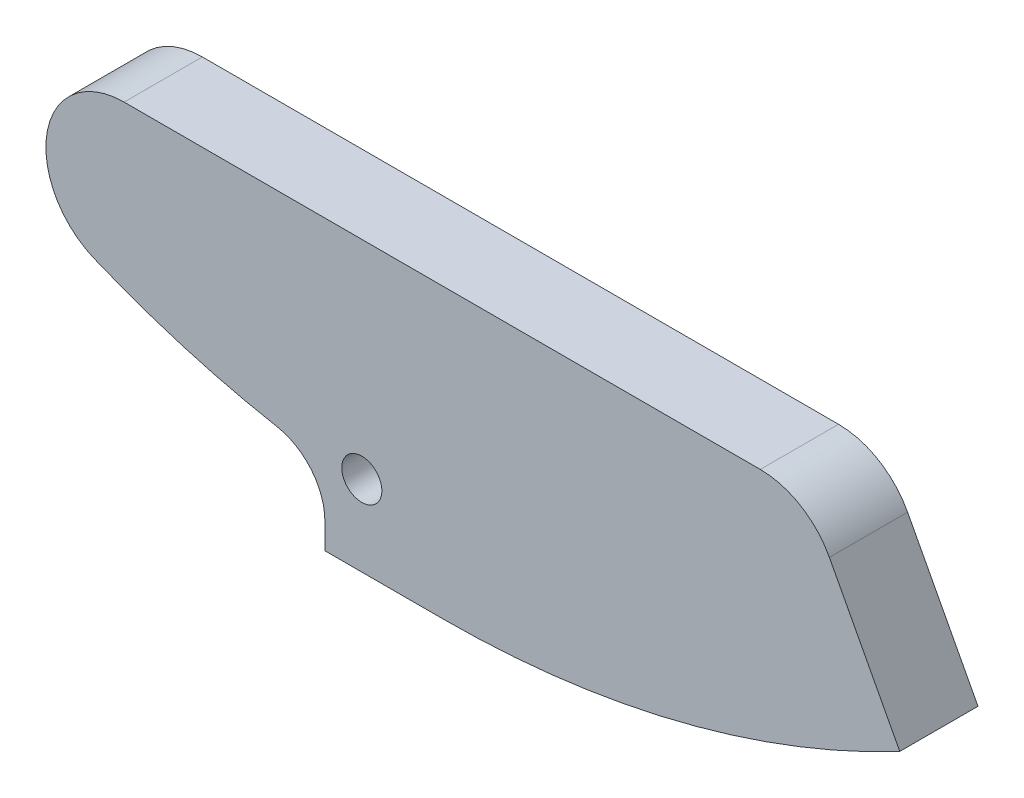
ISO-10303-21;
HEADER;
FILE_DESCRIPTION(('STEP AP214'),'2;1');
FILE_NAME('part.step','',(''),(''),'','','');
FILE_SCHEMA(('AUTOMOTIVE_DESIGN { 1 0 10303 214 1 1 1 1 }'));
ENDSEC;
DATA;
#1=APPLICATION_CONTEXT('core data for automotive mechanical design processes');
#2=APPLICATION_PROTOCOL_DEFINITION('international standard','automotive_design',2000,#1);
#3=PRODUCT_CONTEXT('',#1,'mechanical');
#4=PRODUCT('Part','Part','',(#3));
#5=PRODUCT_RELATED_PRODUCT_CATEGORY('part','',(#4));
#6=PRODUCT_DEFINITION_FORMATION('','',#4);
#7=PRODUCT_DEFINITION_CONTEXT('part definition',#1,'design');
#8=PRODUCT_DEFINITION('design','',#6,#7);
#9=PRODUCT_DEFINITION_SHAPE('','',#8);
#10=(LENGTH_UNIT() NAMED_UNIT(*) SI_UNIT(.MILLI.,.METRE.));
#11=(NAMED_UNIT(*) PLANE_ANGLE_UNIT() SI_UNIT($,.RADIAN.));
#12=(NAMED_UNIT(*) SI_UNIT($,.STERADIAN.) SOLID_ANGLE_UNIT());
#13=UNCERTAINTY_MEASURE_WITH_UNIT(LENGTH_MEASURE(1.E-05),#10,'distance_accuracy_value','');
#14=(GEOMETRIC_REPRESENTATION_CONTEXT(3) GLOBAL_UNCERTAINTY_ASSIGNED_CONTEXT((#13)) GLOBAL_UNIT_ASSIGNED_CONTEXT((#10,
#11,#12)) REPRESENTATION_CONTEXT('',''));
#15=CARTESIAN_POINT('',(0.,0.,0.));
#16=DIRECTION('',(0.,0.,1.));
#17=DIRECTION('',(1.,0.,0.));
#18=AXIS2_PLACEMENT_3D('',#15,#16,#17);
#19=CARTESIAN_POINT('',(0.,0.,4.));
#20=DIRECTION('',(0.,0.,-1.));
#21=DIRECTION('',(-1.,0.,0.));
#22=AXIS2_PLACEMENT_3D('',#19,#20,#21);
#23=CYLINDRICAL_SURFACE('',#22,50.);
#24=CARTESIAN_POINT('',(0.,0.,0.));
#25=DIRECTION('',(0.,0.,1.));
#26=DIRECTION('',(1.,0.,0.));
#27=AXIS2_PLACEMENT_3D('',#24,#25,#26);
#28=CIRCLE('',#27,50.);
#29=CARTESIAN_POINT('',(0.,-50.,0.));
#30=VERTEX_POINT('',#29);
#31=CARTESIAN_POINT('',(23.3969049927199,-44.1880621521428,0.));
#32=VERTEX_POINT('',#31);
#33=EDGE_CURVE('E140',#30,#32,#28,.T.);
#34=ORIENTED_EDGE('',*,*,#33,.T.);
#35=DIRECTION('',(0.,0.,-1.));
#36=VECTOR('',#35,1.);
#37=CARTESIAN_POINT('',(23.3969049927199,-44.1880621521428,4.));
#38=LINE('',#37,#36);
#39=CARTESIAN_POINT('',(23.3969049927199,-44.1880621521428,4.));
#40=VERTEX_POINT('',#39);
#41=EDGE_CURVE('E119',#40,#32,#38,.T.);
#42=ORIENTED_EDGE('',*,*,#41,.F.);
#43=CARTESIAN_POINT('',(0.,0.,4.));
#44=DIRECTION('',(0.,0.,1.));
#45=DIRECTION('',(1.,0.,0.));
#46=AXIS2_PLACEMENT_3D('',#43,#44,#45);
#47=CIRCLE('',#46,50.);
#48=CARTESIAN_POINT('',(0.,-50.,4.));
#49=VERTEX_POINT('',#48);
#50=EDGE_CURVE('E127',#49,#40,#47,.T.);
#51=ORIENTED_EDGE('',*,*,#50,.F.);
#52=DIRECTION('',(0.,0.,-1.));
#53=VECTOR('',#52,1.);
#54=CARTESIAN_POINT('',(0.,-50.,4.));
#55=LINE('',#54,#53);
#56=EDGE_CURVE('E169',#49,#30,#55,.T.);
#57=ORIENTED_EDGE('',*,*,#56,.T.);
#58=EDGE_LOOP('',(#34,#42,#51,#57));
#59=FACE_BOUND('',#58,.T.);
#60=ADVANCED_FACE('F43',(#59),#23,.T.);
#61=CARTESIAN_POINT('',(23.3969049927199,-44.1880621521428,4.));
#62=DIRECTION('',(-0.88369535450442,-0.468062517648346,0.));
#63=DIRECTION('',(0.468062517648346,-0.88369535450442,0.));
#64=AXIS2_PLACEMENT_3D('',#61,#62,#63);
#65=PLANE('',#64);
#66=DIRECTION('',(-0.468062517648346,0.88369535450442,0.));
#67=VECTOR('',#66,1.);
#68=CARTESIAN_POINT('',(23.3969049927199,-44.1880621521428,0.));
#69=LINE('',#68,#67);
#70=CARTESIAN_POINT('',(19.7978706887986,-37.3931367412027,0.));
#71=VERTEX_POINT('',#70);
#72=EDGE_CURVE('E189',#32,#71,#69,.T.);
#73=ORIENTED_EDGE('',*,*,#72,.T.);
#74=DIRECTION('',(0.,0.,-1.));
#75=VECTOR('',#74,1.);
#76=CARTESIAN_POINT('',(19.7978706887986,-37.3931367412027,4.));
#77=LINE('',#76,#75);
#78=CARTESIAN_POINT('',(19.7978706887986,-37.3931367412027,4.));
#79=VERTEX_POINT('',#78);
#80=EDGE_CURVE('E122',#79,#71,#77,.T.);
#81=ORIENTED_EDGE('',*,*,#80,.F.);
#82=DIRECTION('',(-0.468062517648346,0.88369535450442,0.));
#83=VECTOR('',#82,1.);
#84=CARTESIAN_POINT('',(23.3969049927199,-44.1880621521428,4.));
#85=LINE('',#84,#83);
#86=EDGE_CURVE('E115',#40,#79,#85,.T.);
#87=ORIENTED_EDGE('',*,*,#86,.F.);
#88=ORIENTED_EDGE('',*,*,#41,.T.);
#89=EDGE_LOOP('',(#73,#81,#87,#88));
#90=FACE_BOUND('',#89,.T.);
#91=ADVANCED_FACE('F117',(#90),#65,.F.);
#92=CARTESIAN_POINT('',(16.2640458755163,-39.2648801317297,4.));
#93=DIRECTION('',(0.,0.,-1.));
#94=DIRECTION('',(-1.,0.,0.));
#95=AXIS2_PLACEMENT_3D('',#92,#93,#94);
#96=CYLINDRICAL_SURFACE('',#95,3.99891749489166);
#97=CARTESIAN_POINT('',(16.2640458755163,-39.2648801317297,0.));
#98=DIRECTION('',(0.,0.,1.));
#99=DIRECTION('',(-1.,0.,0.));
#100=AXIS2_PLACEMENT_3D('',#97,#98,#99);
#101=CIRCLE('',#100,3.99891749489166);
#102=CARTESIAN_POINT('',(16.2640458755163,-35.265962636838,0.));
#103=VERTEX_POINT('',#102);
#104=EDGE_CURVE('E186',#71,#103,#101,.T.);
#105=ORIENTED_EDGE('',*,*,#104,.T.);
#106=DIRECTION('',(0.,0.,-1.));
#107=VECTOR('',#106,1.);
#108=CARTESIAN_POINT('',(16.2640458755163,-35.265962636838,4.));
#109=LINE('',#108,#107);
#110=CARTESIAN_POINT('',(16.2640458755163,-35.265962636838,4.));
#111=VERTEX_POINT('',#110);
#112=EDGE_CURVE('E148',#111,#103,#109,.T.);
#113=ORIENTED_EDGE('',*,*,#112,.F.);
#114=CARTESIAN_POINT('',(16.2640458755163,-39.2648801317297,4.));
#115=DIRECTION('',(0.,0.,1.));
#116=DIRECTION('',(-1.,0.,0.));
#117=AXIS2_PLACEMENT_3D('',#114,#115,#116);
#118=CIRCLE('',#117,3.99891749489166);
#119=EDGE_CURVE('E126',#79,#111,#118,.T.);
#120=ORIENTED_EDGE('',*,*,#119,.F.);
#121=ORIENTED_EDGE('',*,*,#80,.T.);
#122=EDGE_LOOP('',(#105,#113,#120,#121));
#123=FACE_BOUND('',#122,.T.);
#124=ADVANCED_FACE('F239',(#123),#96,.T.);
#125=CARTESIAN_POINT('',(-16.2640458755163,-35.2648801317297,4.));
#126=DIRECTION('',(-3.32790843072671E-05,-0.999999999446251,0.));
#127=DIRECTION('',(0.999999999446251,-3.32790843072671E-05,0.));
#128=AXIS2_PLACEMENT_3D('',#125,#126,#127);
#129=PLANE('',#128);
#130=DIRECTION('',(-0.999999999446251,3.32790843072671E-05,0.));
#131=VECTOR('',#130,1.);
#132=CARTESIAN_POINT('',(-16.2640458755163,-35.2648801317297,0.));
#133=LINE('',#132,#131);
#134=CARTESIAN_POINT('',(-16.2640458755163,-35.2648801317297,0.));
#135=VERTEX_POINT('',#134);
#136=EDGE_CURVE('E183',#103,#135,#133,.T.);
#137=ORIENTED_EDGE('',*,*,#136,.T.);
#138=DIRECTION('',(0.,0.,-1.));
#139=VECTOR('',#138,1.);
#140=CARTESIAN_POINT('',(-16.2640458755163,-35.2648801317297,4.));
#141=LINE('',#140,#139);
#142=CARTESIAN_POINT('',(-16.2640458755163,-35.2648801317297,4.));
#143=VERTEX_POINT('',#142);
#144=EDGE_CURVE('E157',#143,#135,#141,.T.);
#145=ORIENTED_EDGE('',*,*,#144,.F.);
#146=DIRECTION('',(-0.999999999446251,3.32790843072671E-05,0.));
#147=VECTOR('',#146,1.);
#148=CARTESIAN_POINT('',(-16.2640458755163,-35.2648801317297,4.));
#149=LINE('',#148,#147);
#150=EDGE_CURVE('E206',#111,#143,#149,.T.);
#151=ORIENTED_EDGE('',*,*,#150,.F.);
#152=ORIENTED_EDGE('',*,*,#112,.T.);
#153=EDGE_LOOP('',(#137,#145,#151,#152));
#154=FACE_BOUND('',#153,.T.);
#155=ADVANCED_FACE('F244',(#154),#129,.F.);
#156=CARTESIAN_POINT('',(-16.2640458755163,-39.2648801317297,4.));
#157=DIRECTION('',(0.,0.,-1.));
#158=DIRECTION('',(-1.,0.,0.));
#159=AXIS2_PLACEMENT_3D('',#156,#157,#158);
#160=CYLINDRICAL_SURFACE('',#159,4.);
#161=CARTESIAN_POINT('',(-16.2640458755163,-39.2648801317297,0.));
#162=DIRECTION('',(0.,0.,1.));
#163=DIRECTION('',(1.,0.,0.));
#164=AXIS2_PLACEMENT_3D('',#161,#162,#163);
#165=CIRCLE('',#164,4.);
#166=CARTESIAN_POINT('',(-17.7947796049767,-42.9603982617748,0.));
#167=VERTEX_POINT('',#166);
#168=EDGE_CURVE('E180',#135,#167,#165,.T.);
#169=ORIENTED_EDGE('',*,*,#168,.T.);
#170=DIRECTION('',(0.,0.,-1.));
#171=VECTOR('',#170,1.);
#172=CARTESIAN_POINT('',(-17.7947796049767,-42.9603982617748,4.));
#173=LINE('',#172,#171);
#174=CARTESIAN_POINT('',(-17.7947796049767,-42.9603982617748,4.));
#175=VERTEX_POINT('',#174);
#176=EDGE_CURVE('E161',#175,#167,#173,.T.);
#177=ORIENTED_EDGE('',*,*,#176,.F.);
#178=CARTESIAN_POINT('',(-16.2640458755163,-39.2648801317297,4.));
#179=DIRECTION('',(0.,0.,1.));
#180=DIRECTION('',(1.,0.,0.));
#181=AXIS2_PLACEMENT_3D('',#178,#179,#180);
#182=CIRCLE('',#181,4.);
#183=EDGE_CURVE('E203',#143,#175,#182,.T.);
#184=ORIENTED_EDGE('',*,*,#183,.F.);
#185=ORIENTED_EDGE('',*,*,#144,.T.);
#186=EDGE_LOOP('',(#169,#177,#184,#185));
#187=FACE_BOUND('',#186,.T.);
#188=ADVANCED_FACE('F248',(#187),#160,.T.);
#189=CARTESIAN_POINT('',(0.,0.,4.));
#190=DIRECTION('',(0.,0.,-1.));
#191=DIRECTION('',(-1.,0.,0.));
#192=AXIS2_PLACEMENT_3D('',#189,#190,#191);
#193=CYLINDRICAL_SURFACE('',#192,46.5);
#194=CARTESIAN_POINT('',(0.,0.,0.));
#195=DIRECTION('',(0.,0.,1.));
#196=DIRECTION('',(1.,0.,0.));
#197=AXIS2_PLACEMENT_3D('',#194,#195,#196);
#198=CIRCLE('',#197,46.5);
#199=CARTESIAN_POINT('',(-8.45454545454545,-45.724945720657,0.));
#200=VERTEX_POINT('',#199);
#201=EDGE_CURVE('E177',#167,#200,#198,.T.);
#202=ORIENTED_EDGE('',*,*,#201,.T.);
#203=DIRECTION('',(0.,0.,-1.));
#204=VECTOR('',#203,1.);
#205=CARTESIAN_POINT('',(-8.45454545454545,-45.724945720657,4.));
#206=LINE('',#205,#204);
#207=CARTESIAN_POINT('',(-8.45454545454545,-45.724945720657,4.));
#208=VERTEX_POINT('',#207);
#209=EDGE_CURVE('E59',#200,#208,#206,.F.);
#210=ORIENTED_EDGE('',*,*,#209,.T.);
#211=CARTESIAN_POINT('',(0.,0.,4.));
#212=DIRECTION('',(0.,0.,1.));
#213=DIRECTION('',(1.,0.,0.));
#214=AXIS2_PLACEMENT_3D('',#211,#212,#213);
#215=CIRCLE('',#214,46.5);
#216=EDGE_CURVE('E200',#175,#208,#215,.T.);
#217=ORIENTED_EDGE('',*,*,#216,.F.);
#218=ORIENTED_EDGE('',*,*,#176,.T.);
#219=EDGE_LOOP('',(#202,#210,#217,#218));
#220=FACE_BOUND('',#219,.T.);
#221=ADVANCED_FACE('F252',(#220),#193,.T.);
#222=CARTESIAN_POINT('',(-5.99999999999999,-46.1112784468182,4.));
#223=DIRECTION('',(1.,0.,0.));
#224=DIRECTION('',(0.,0.,-1.));
#225=AXIS2_PLACEMENT_3D('',#222,#223,#224);
#226=PLANE('',#225);
#227=DIRECTION('',(0.,-1.,0.));
#228=VECTOR('',#227,1.);
#229=CARTESIAN_POINT('',(-5.99999999999999,-46.1112784468182,4.));
#230=LINE('',#229,#228);
#231=CARTESIAN_POINT('',(-5.99999999999999,-48.6749422187639,4.));
#232=VERTEX_POINT('',#231);
#233=CARTESIAN_POINT('',(-5.99999999999999,-50.,4.));
#234=VERTEX_POINT('',#233);
#235=EDGE_CURVE('E197',#232,#234,#230,.T.);
#236=ORIENTED_EDGE('',*,*,#235,.F.);
#237=DIRECTION('',(0.,0.,1.));
#238=VECTOR('',#237,1.);
#239=CARTESIAN_POINT('',(-5.99999999999999,-48.6749422187639,0.));
#240=LINE('',#239,#238);
#241=CARTESIAN_POINT('',(-5.99999999999999,-48.6749422187639,0.));
#242=VERTEX_POINT('',#241);
#243=EDGE_CURVE('E142',#232,#242,#240,.F.);
#244=ORIENTED_EDGE('',*,*,#243,.T.);
#245=DIRECTION('',(0.,-1.,0.));
#246=VECTOR('',#245,1.);
#247=CARTESIAN_POINT('',(-5.99999999999999,-46.1112784468182,0.));
#248=LINE('',#247,#246);
#249=CARTESIAN_POINT('',(-5.99999999999999,-50.,0.));
#250=VERTEX_POINT('',#249);
#251=EDGE_CURVE('E174',#242,#250,#248,.T.);
#252=ORIENTED_EDGE('',*,*,#251,.T.);
#253=DIRECTION('',(0.,0.,-1.));
#254=VECTOR('',#253,1.);
#255=CARTESIAN_POINT('',(-5.99999999999999,-50.,4.));
#256=LINE('',#255,#254);
#257=EDGE_CURVE('E165',#234,#250,#256,.T.);
#258=ORIENTED_EDGE('',*,*,#257,.F.);
#259=EDGE_LOOP('',(#236,#244,#252,#258));
#260=FACE_BOUND('',#259,.T.);
#261=ADVANCED_FACE('F231',(#260),#226,.F.);
#262=CARTESIAN_POINT('',(0.,-50.,4.));
#263=DIRECTION('',(0.,1.,0.));
#264=DIRECTION('',(0.,0.,1.));
#265=AXIS2_PLACEMENT_3D('',#262,#263,#264);
#266=PLANE('',#265);
#267=DIRECTION('',(1.,0.,0.));
#268=VECTOR('',#267,1.);
#269=CARTESIAN_POINT('',(0.,-50.,0.));
#270=LINE('',#269,#268);
#271=EDGE_CURVE('E137',#250,#30,#270,.T.);
#272=ORIENTED_EDGE('',*,*,#271,.T.);
#273=ORIENTED_EDGE('',*,*,#56,.F.);
#274=DIRECTION('',(1.,0.,0.));
#275=VECTOR('',#274,1.);
#276=CARTESIAN_POINT('',(0.,-50.,4.));
#277=LINE('',#276,#275);
#278=EDGE_CURVE('E132',#234,#49,#277,.T.);
#279=ORIENTED_EDGE('',*,*,#278,.F.);
#280=ORIENTED_EDGE('',*,*,#257,.T.);
#281=EDGE_LOOP('',(#272,#273,#279,#280));
#282=FACE_BOUND('',#281,.T.);
#283=ADVANCED_FACE('F223',(#282),#266,.F.);
#284=CARTESIAN_POINT('',(0.,0.,4.));
#285=DIRECTION('',(0.,0.,1.));
#286=DIRECTION('',(1.,0.,0.));
#287=AXIS2_PLACEMENT_3D('',#284,#285,#286);
#288=PLANE('',#287);
#289=CARTESIAN_POINT('',(-4.10999999999999,-45.89,4.));
#290=DIRECTION('',(0.,0.,1.));
#291=DIRECTION('',(1.,0.,0.));
#292=AXIS2_PLACEMENT_3D('',#289,#290,#291);
#293=CIRCLE('',#292,1.025);
#294=CARTESIAN_POINT('',(-3.08499999999999,-45.89,4.));
#295=VERTEX_POINT('',#294);
#296=EDGE_CURVE('E214',#295,#295,#293,.T.);
#297=ORIENTED_EDGE('',*,*,#296,.F.);
#298=EDGE_LOOP('',(#297));
#299=FACE_BOUND('',#298,.T.);
#300=ORIENTED_EDGE('',*,*,#50,.T.);
#301=ORIENTED_EDGE('',*,*,#86,.T.);
#302=ORIENTED_EDGE('',*,*,#119,.T.);
#303=ORIENTED_EDGE('',*,*,#150,.T.);
#304=ORIENTED_EDGE('',*,*,#183,.T.);
#305=ORIENTED_EDGE('',*,*,#216,.T.);
#306=CARTESIAN_POINT('',(-8.99999999999999,-48.6749422187639,4.));
#307=DIRECTION('',(0.,0.,1.));
#308=DIRECTION('',(1.,0.,0.));
#309=AXIS2_PLACEMENT_3D('',#306,#307,#308);
#310=CIRCLE('',#309,3.);
#311=EDGE_CURVE('E11',#208,#232,#310,.F.);
#312=ORIENTED_EDGE('',*,*,#311,.T.);
#313=ORIENTED_EDGE('',*,*,#235,.T.);
#314=ORIENTED_EDGE('',*,*,#278,.T.);
#315=EDGE_LOOP('',(#300,#301,#302,#303,#304,#305,#312,#313,#314));
#316=FACE_BOUND('',#315,.T.);
#317=ADVANCED_FACE('F130',(#299,#316),#288,.T.);
#318=CARTESIAN_POINT('',(0.,0.,0.));
#319=DIRECTION('',(0.,0.,1.));
#320=DIRECTION('',(1.,0.,0.));
#321=AXIS2_PLACEMENT_3D('',#318,#319,#320);
#322=PLANE('',#321);
#323=CARTESIAN_POINT('',(-4.10999999999999,-45.89,0.));
#324=DIRECTION('',(0.,0.,1.));
#325=DIRECTION('',(1.,0.,0.));
#326=AXIS2_PLACEMENT_3D('',#323,#324,#325);
#327=CIRCLE('',#326,1.025);
#328=CARTESIAN_POINT('',(-3.085,-45.89,0.));
#329=VERTEX_POINT('',#328);
#330=EDGE_CURVE('E194',#329,#329,#327,.T.);
#331=ORIENTED_EDGE('',*,*,#330,.T.);
#332=EDGE_LOOP('',(#331));
#333=FACE_BOUND('',#332,.T.);
#334=ORIENTED_EDGE('',*,*,#33,.F.);
#335=ORIENTED_EDGE('',*,*,#271,.F.);
#336=ORIENTED_EDGE('',*,*,#251,.F.);
#337=CARTESIAN_POINT('',(-8.99999999999999,-48.6749422187639,0.));
#338=DIRECTION('',(0.,0.,1.));
#339=DIRECTION('',(1.,0.,0.));
#340=AXIS2_PLACEMENT_3D('',#337,#338,#339);
#341=CIRCLE('',#340,3.);
#342=EDGE_CURVE('E52',#242,#200,#341,.T.);
#343=ORIENTED_EDGE('',*,*,#342,.T.);
#344=ORIENTED_EDGE('',*,*,#201,.F.);
#345=ORIENTED_EDGE('',*,*,#168,.F.);
#346=ORIENTED_EDGE('',*,*,#136,.F.);
#347=ORIENTED_EDGE('',*,*,#104,.F.);
#348=ORIENTED_EDGE('',*,*,#72,.F.);
#349=EDGE_LOOP('',(#334,#335,#336,#343,#344,#345,#346,#347,#348));
#350=FACE_BOUND('',#349,.T.);
#351=ADVANCED_FACE('F222',(#333,#350),#322,.F.);
#352=CARTESIAN_POINT('',(-4.10999999999999,-45.89,4.));
#353=DIRECTION('',(0.,0.,1.));
#354=DIRECTION('',(1.,0.,0.));
#355=AXIS2_PLACEMENT_3D('',#352,#353,#354);
#356=CYLINDRICAL_SURFACE('',#355,1.025);
#357=ORIENTED_EDGE('',*,*,#330,.F.);
#358=EDGE_LOOP('',(#357));
#359=FACE_BOUND('',#358,.T.);
#360=ORIENTED_EDGE('',*,*,#296,.T.);
#361=EDGE_LOOP('',(#360));
#362=FACE_BOUND('',#361,.T.);
#363=ADVANCED_FACE('F219',(#359,#362),#356,.F.);
#364=CARTESIAN_POINT('',(-8.99999999999999,-48.6749422187639,4.));
#365=DIRECTION('',(0.,0.,-1.));
#366=DIRECTION('',(-1.,0.,0.));
#367=AXIS2_PLACEMENT_3D('',#364,#365,#366);
#368=CYLINDRICAL_SURFACE('',#367,3.);
#369=ORIENTED_EDGE('',*,*,#311,.F.);
#370=ORIENTED_EDGE('',*,*,#209,.F.);
#371=ORIENTED_EDGE('',*,*,#342,.F.);
#372=ORIENTED_EDGE('',*,*,#243,.F.);
#373=EDGE_LOOP('',(#369,#370,#371,#372));
#374=FACE_BOUND('',#373,.T.);
#375=ADVANCED_FACE('F45',(#374),#368,.F.);
#376=CLOSED_SHELL('',(#60,#91,#124,#155,#188,#221,#261,#283,#317,#351,#363,#375));
#377=MANIFOLD_SOLID_BREP('B2',#376);
#378=ADVANCED_BREP_SHAPE_REPRESENTATION('',(#18,#377),#14);
#379=SHAPE_DEFINITION_REPRESENTATION(#9,#378);
ENDSEC;
END-ISO-10303-21;
